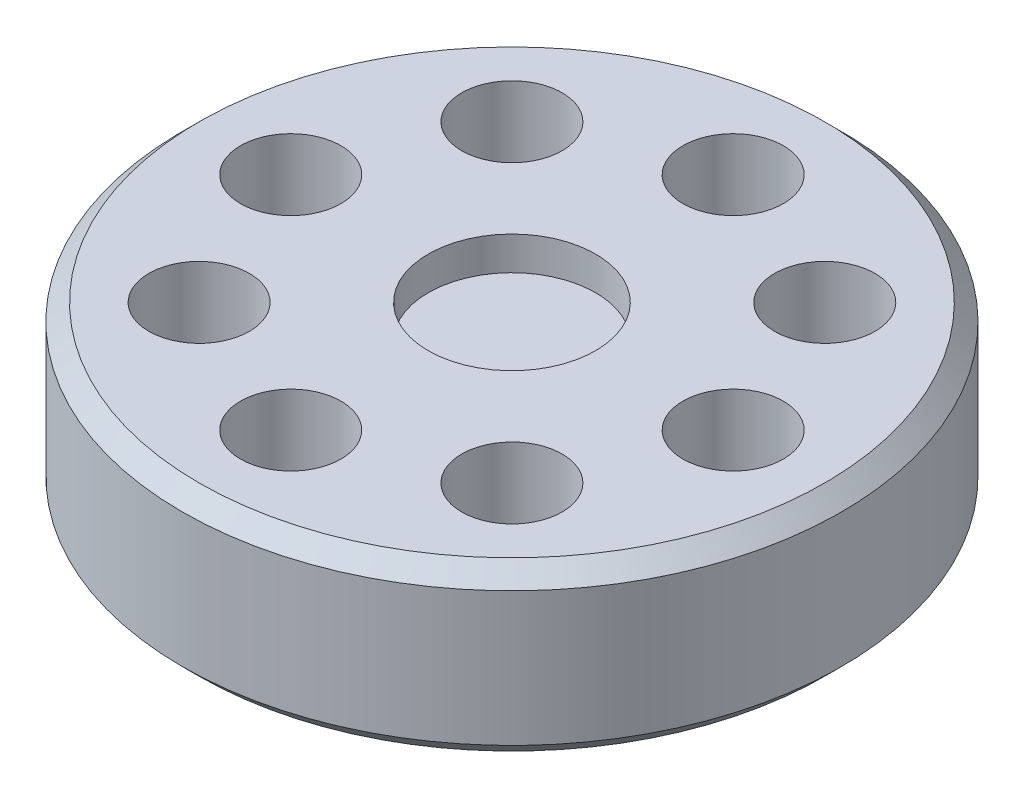
ISO-10303-21;
HEADER;
FILE_DESCRIPTION(('STEP AP214'),'2;1');
FILE_NAME('part.step','',(''),(''),'','','');
FILE_SCHEMA(('AUTOMOTIVE_DESIGN { 1 0 10303 214 1 1 1 1 }'));
ENDSEC;
DATA;
#1=APPLICATION_CONTEXT('core data for automotive mechanical design processes');
#2=APPLICATION_PROTOCOL_DEFINITION('international standard','automotive_design',2000,#1);
#3=PRODUCT_CONTEXT('',#1,'mechanical');
#4=PRODUCT('Part','Part','',(#3));
#5=PRODUCT_RELATED_PRODUCT_CATEGORY('part','',(#4));
#6=PRODUCT_DEFINITION_FORMATION('','',#4);
#7=PRODUCT_DEFINITION_CONTEXT('part definition',#1,'design');
#8=PRODUCT_DEFINITION('design','',#6,#7);
#9=PRODUCT_DEFINITION_SHAPE('','',#8);
#10=(LENGTH_UNIT() NAMED_UNIT(*) SI_UNIT(.MILLI.,.METRE.));
#11=(NAMED_UNIT(*) PLANE_ANGLE_UNIT() SI_UNIT($,.RADIAN.));
#12=(NAMED_UNIT(*) SI_UNIT($,.STERADIAN.) SOLID_ANGLE_UNIT());
#13=UNCERTAINTY_MEASURE_WITH_UNIT(LENGTH_MEASURE(1.E-05),#10,'distance_accuracy_value','');
#14=(GEOMETRIC_REPRESENTATION_CONTEXT(3) GLOBAL_UNCERTAINTY_ASSIGNED_CONTEXT((#13)) GLOBAL_UNIT_ASSIGNED_CONTEXT((#10,
#11,#12)) REPRESENTATION_CONTEXT('',''));
#15=CARTESIAN_POINT('',(0.,0.,0.));
#16=DIRECTION('',(0.,0.,1.));
#17=DIRECTION('',(1.,0.,0.));
#18=AXIS2_PLACEMENT_3D('',#15,#16,#17);
#19=CARTESIAN_POINT('',(0.,25.4,0.));
#20=DIRECTION('',(0.,-1.,0.));
#21=DIRECTION('',(0.,0.,-1.));
#22=AXIS2_PLACEMENT_3D('',#19,#20,#21);
#23=CYLINDRICAL_SURFACE('',#22,50.);
#24=CARTESIAN_POINT('',(0.,2.54000000000001,0.));
#25=DIRECTION('',(0.,1.,0.));
#26=DIRECTION('',(0.,0.,1.));
#27=AXIS2_PLACEMENT_3D('',#24,#25,#26);
#28=CIRCLE('',#27,50.);
#29=CARTESIAN_POINT('',(0.,2.54000000000001,50.));
#30=VERTEX_POINT('',#29);
#31=EDGE_CURVE('E43',#30,#30,#28,.T.);
#32=ORIENTED_EDGE('',*,*,#31,.T.);
#33=EDGE_LOOP('',(#32));
#34=FACE_BOUND('',#33,.T.);
#35=CARTESIAN_POINT('',(0.,22.86,0.));
#36=DIRECTION('',(0.,1.,0.));
#37=DIRECTION('',(0.,0.,1.));
#38=AXIS2_PLACEMENT_3D('',#35,#36,#37);
#39=CIRCLE('',#38,50.);
#40=CARTESIAN_POINT('',(0.,22.86,50.));
#41=VERTEX_POINT('',#40);
#42=EDGE_CURVE('E47',#41,#41,#39,.F.);
#43=ORIENTED_EDGE('',*,*,#42,.T.);
#44=EDGE_LOOP('',(#43));
#45=FACE_BOUND('',#44,.T.);
#46=ADVANCED_FACE('F32',(#34,#45),#23,.T.);
#47=CARTESIAN_POINT('',(0.,25.4,0.));
#48=DIRECTION('',(0.,1.,0.));
#49=DIRECTION('',(0.,0.,1.));
#50=AXIS2_PLACEMENT_3D('',#47,#48,#49);
#51=PLANE('',#50);
#52=CARTESIAN_POINT('',(-23.73,25.4,-23.73));
#53=DIRECTION('',(0.,1.,0.));
#54=DIRECTION('',(0.,0.,1.));
#55=AXIS2_PLACEMENT_3D('',#52,#53,#54);
#56=CIRCLE('',#55,7.62);
#57=CARTESIAN_POINT('',(-23.73,25.4,-16.11));
#58=VERTEX_POINT('',#57);
#59=EDGE_CURVE('E75',#58,#58,#56,.T.);
#60=ORIENTED_EDGE('',*,*,#59,.F.);
#61=EDGE_LOOP('',(#60));
#62=FACE_BOUND('',#61,.T.);
#63=CARTESIAN_POINT('',(23.73,25.4,-23.73));
#64=DIRECTION('',(0.,1.,0.));
#65=DIRECTION('',(0.,0.,1.));
#66=AXIS2_PLACEMENT_3D('',#63,#64,#65);
#67=CIRCLE('',#66,7.62);
#68=CARTESIAN_POINT('',(23.73,25.4,-16.11));
#69=VERTEX_POINT('',#68);
#70=EDGE_CURVE('E68',#69,#69,#67,.T.);
#71=ORIENTED_EDGE('',*,*,#70,.F.);
#72=EDGE_LOOP('',(#71));
#73=FACE_BOUND('',#72,.T.);
#74=CARTESIAN_POINT('',(-2.0122792321331E-13,25.4,-33.5592878351133));
#75=DIRECTION('',(0.,1.,0.));
#76=DIRECTION('',(0.,0.,1.));
#77=AXIS2_PLACEMENT_3D('',#74,#75,#76);
#78=CIRCLE('',#77,7.62);
#79=CARTESIAN_POINT('',(-2.0122792321331E-13,25.4,-25.9392878351133));
#80=VERTEX_POINT('',#79);
#81=EDGE_CURVE('E69',#80,#80,#78,.T.);
#82=ORIENTED_EDGE('',*,*,#81,.F.);
#83=EDGE_LOOP('',(#82));
#84=FACE_BOUND('',#83,.T.);
#85=CARTESIAN_POINT('',(-33.5592878351138,25.4,2.08166817117217E-13));
#86=DIRECTION('',(0.,1.,0.));
#87=DIRECTION('',(0.,0.,1.));
#88=AXIS2_PLACEMENT_3D('',#85,#86,#87);
#89=CIRCLE('',#88,7.62);
#90=CARTESIAN_POINT('',(-33.5592878351138,25.4,7.62000000000021));
#91=VERTEX_POINT('',#90);
#92=EDGE_CURVE('E86',#91,#91,#89,.T.);
#93=ORIENTED_EDGE('',*,*,#92,.F.);
#94=EDGE_LOOP('',(#93));
#95=FACE_BOUND('',#94,.T.);
#96=CARTESIAN_POINT('',(-23.73,25.4,23.73));
#97=DIRECTION('',(0.,1.,0.));
#98=DIRECTION('',(0.,0.,1.));
#99=AXIS2_PLACEMENT_3D('',#96,#97,#98);
#100=CIRCLE('',#99,7.62);
#101=CARTESIAN_POINT('',(-23.73,25.4,31.35));
#102=VERTEX_POINT('',#101);
#103=EDGE_CURVE('E92',#102,#102,#100,.T.);
#104=ORIENTED_EDGE('',*,*,#103,.F.);
#105=EDGE_LOOP('',(#104));
#106=FACE_BOUND('',#105,.T.);
#107=CARTESIAN_POINT('',(2.0122792321331E-13,25.4,33.5592878351133));
#108=DIRECTION('',(0.,1.,0.));
#109=DIRECTION('',(0.,0.,1.));
#110=AXIS2_PLACEMENT_3D('',#107,#108,#109);
#111=CIRCLE('',#110,7.62);
#112=CARTESIAN_POINT('',(2.0122792321331E-13,25.4,41.1792878351133));
#113=VERTEX_POINT('',#112);
#114=EDGE_CURVE('E98',#113,#113,#111,.T.);
#115=ORIENTED_EDGE('',*,*,#114,.F.);
#116=EDGE_LOOP('',(#115));
#117=FACE_BOUND('',#116,.T.);
#118=CARTESIAN_POINT('',(23.73,25.4,23.73));
#119=DIRECTION('',(0.,1.,0.));
#120=DIRECTION('',(0.,0.,1.));
#121=AXIS2_PLACEMENT_3D('',#118,#119,#120);
#122=CIRCLE('',#121,7.62);
#123=CARTESIAN_POINT('',(23.73,25.4,31.35));
#124=VERTEX_POINT('',#123);
#125=EDGE_CURVE('E62',#124,#124,#122,.T.);
#126=ORIENTED_EDGE('',*,*,#125,.F.);
#127=EDGE_LOOP('',(#126));
#128=FACE_BOUND('',#127,.T.);
#129=CARTESIAN_POINT('',(33.5592878351138,25.4,-2.0122792321331E-13));
#130=DIRECTION('',(0.,1.,0.));
#131=DIRECTION('',(0.,0.,1.));
#132=AXIS2_PLACEMENT_3D('',#129,#130,#131);
#133=CIRCLE('',#132,7.62);
#134=CARTESIAN_POINT('',(33.5592878351138,25.4,7.6199999999998));
#135=VERTEX_POINT('',#134);
#136=EDGE_CURVE('E59',#135,#135,#133,.T.);
#137=ORIENTED_EDGE('',*,*,#136,.F.);
#138=EDGE_LOOP('',(#137));
#139=FACE_BOUND('',#138,.T.);
#140=CARTESIAN_POINT('',(0.,25.4,0.));
#141=DIRECTION('',(0.,1.,0.));
#142=DIRECTION('',(0.,0.,1.));
#143=AXIS2_PLACEMENT_3D('',#140,#141,#142);
#144=CIRCLE('',#143,47.46);
#145=CARTESIAN_POINT('',(0.,25.4,47.46));
#146=VERTEX_POINT('',#145);
#147=EDGE_CURVE('E10',#146,#146,#144,.T.);
#148=ORIENTED_EDGE('',*,*,#147,.T.);
#149=EDGE_LOOP('',(#148));
#150=FACE_BOUND('',#149,.T.);
#151=CARTESIAN_POINT('',(0.,25.4,0.));
#152=DIRECTION('',(0.,1.,0.));
#153=DIRECTION('',(0.,0.,1.));
#154=AXIS2_PLACEMENT_3D('',#151,#152,#153);
#155=CIRCLE('',#154,12.7);
#156=CARTESIAN_POINT('',(0.,25.4,12.7));
#157=VERTEX_POINT('',#156);
#158=EDGE_CURVE('E53',#157,#157,#155,.T.);
#159=ORIENTED_EDGE('',*,*,#158,.F.);
#160=EDGE_LOOP('',(#159));
#161=FACE_BOUND('',#160,.T.);
#162=ADVANCED_FACE('F109',(#62,#73,#84,#95,#106,#117,#128,#139,#150,#161),#51,.T.);
#163=CARTESIAN_POINT('',(0.,0.,0.));
#164=DIRECTION('',(0.,1.,0.));
#165=DIRECTION('',(0.,0.,1.));
#166=AXIS2_PLACEMENT_3D('',#163,#164,#165);
#167=PLANE('',#166);
#168=CARTESIAN_POINT('',(-23.73,0.,-23.73));
#169=DIRECTION('',(0.,1.,0.));
#170=DIRECTION('',(0.,0.,1.));
#171=AXIS2_PLACEMENT_3D('',#168,#169,#170);
#172=CIRCLE('',#171,7.62);
#173=CARTESIAN_POINT('',(-23.73,0.,-16.11));
#174=VERTEX_POINT('',#173);
#175=EDGE_CURVE('E72',#174,#174,#172,.T.);
#176=ORIENTED_EDGE('',*,*,#175,.T.);
#177=EDGE_LOOP('',(#176));
#178=FACE_BOUND('',#177,.T.);
#179=CARTESIAN_POINT('',(23.73,0.,-23.73));
#180=DIRECTION('',(0.,1.,0.));
#181=DIRECTION('',(0.,0.,1.));
#182=AXIS2_PLACEMENT_3D('',#179,#180,#181);
#183=CIRCLE('',#182,7.62);
#184=CARTESIAN_POINT('',(23.73,0.,-16.11));
#185=VERTEX_POINT('',#184);
#186=EDGE_CURVE('E65',#185,#185,#183,.T.);
#187=ORIENTED_EDGE('',*,*,#186,.T.);
#188=EDGE_LOOP('',(#187));
#189=FACE_BOUND('',#188,.T.);
#190=CARTESIAN_POINT('',(-2.0122792321331E-13,0.,-33.5592878351133));
#191=DIRECTION('',(0.,1.,0.));
#192=DIRECTION('',(0.,0.,1.));
#193=AXIS2_PLACEMENT_3D('',#190,#191,#192);
#194=CIRCLE('',#193,7.62);
#195=CARTESIAN_POINT('',(-2.0122792321331E-13,0.,-25.9392878351133));
#196=VERTEX_POINT('',#195);
#197=EDGE_CURVE('E79',#196,#196,#194,.T.);
#198=ORIENTED_EDGE('',*,*,#197,.T.);
#199=EDGE_LOOP('',(#198));
#200=FACE_BOUND('',#199,.T.);
#201=CARTESIAN_POINT('',(-33.5592878351138,0.,2.08166817117217E-13));
#202=DIRECTION('',(0.,1.,0.));
#203=DIRECTION('',(0.,0.,1.));
#204=AXIS2_PLACEMENT_3D('',#201,#202,#203);
#205=CIRCLE('',#204,7.62);
#206=CARTESIAN_POINT('',(-33.5592878351138,0.,7.62000000000021));
#207=VERTEX_POINT('',#206);
#208=EDGE_CURVE('E78',#207,#207,#205,.T.);
#209=ORIENTED_EDGE('',*,*,#208,.T.);
#210=EDGE_LOOP('',(#209));
#211=FACE_BOUND('',#210,.T.);
#212=CARTESIAN_POINT('',(-23.73,0.,23.73));
#213=DIRECTION('',(0.,1.,0.));
#214=DIRECTION('',(0.,0.,1.));
#215=AXIS2_PLACEMENT_3D('',#212,#213,#214);
#216=CIRCLE('',#215,7.62);
#217=CARTESIAN_POINT('',(-23.73,0.,31.35));
#218=VERTEX_POINT('',#217);
#219=EDGE_CURVE('E89',#218,#218,#216,.T.);
#220=ORIENTED_EDGE('',*,*,#219,.T.);
#221=EDGE_LOOP('',(#220));
#222=FACE_BOUND('',#221,.T.);
#223=CARTESIAN_POINT('',(2.0122792321331E-13,0.,33.5592878351133));
#224=DIRECTION('',(0.,1.,0.));
#225=DIRECTION('',(0.,0.,1.));
#226=AXIS2_PLACEMENT_3D('',#223,#224,#225);
#227=CIRCLE('',#226,7.62);
#228=CARTESIAN_POINT('',(2.0122792321331E-13,0.,41.1792878351133));
#229=VERTEX_POINT('',#228);
#230=EDGE_CURVE('E95',#229,#229,#227,.T.);
#231=ORIENTED_EDGE('',*,*,#230,.T.);
#232=EDGE_LOOP('',(#231));
#233=FACE_BOUND('',#232,.T.);
#234=CARTESIAN_POINT('',(23.73,0.,23.73));
#235=DIRECTION('',(0.,1.,0.));
#236=DIRECTION('',(0.,0.,1.));
#237=AXIS2_PLACEMENT_3D('',#234,#235,#236);
#238=CIRCLE('',#237,7.62);
#239=CARTESIAN_POINT('',(23.73,0.,31.35));
#240=VERTEX_POINT('',#239);
#241=EDGE_CURVE('E101',#240,#240,#238,.T.);
#242=ORIENTED_EDGE('',*,*,#241,.T.);
#243=EDGE_LOOP('',(#242));
#244=FACE_BOUND('',#243,.T.);
#245=CARTESIAN_POINT('',(33.5592878351138,0.,-2.0122792321331E-13));
#246=DIRECTION('',(0.,1.,0.));
#247=DIRECTION('',(0.,0.,1.));
#248=AXIS2_PLACEMENT_3D('',#245,#246,#247);
#249=CIRCLE('',#248,7.62);
#250=CARTESIAN_POINT('',(33.5592878351138,0.,7.6199999999998));
#251=VERTEX_POINT('',#250);
#252=EDGE_CURVE('E56',#251,#251,#249,.T.);
#253=ORIENTED_EDGE('',*,*,#252,.T.);
#254=EDGE_LOOP('',(#253));
#255=FACE_BOUND('',#254,.T.);
#256=CARTESIAN_POINT('',(0.,0.,0.));
#257=DIRECTION('',(0.,1.,0.));
#258=DIRECTION('',(0.,0.,1.));
#259=AXIS2_PLACEMENT_3D('',#256,#257,#258);
#260=CIRCLE('',#259,47.46);
#261=CARTESIAN_POINT('',(0.,0.,47.46));
#262=VERTEX_POINT('',#261);
#263=EDGE_CURVE('E39',#262,#262,#260,.F.);
#264=ORIENTED_EDGE('',*,*,#263,.T.);
#265=EDGE_LOOP('',(#264));
#266=FACE_BOUND('',#265,.T.);
#267=ADVANCED_FACE('F112',(#178,#189,#200,#211,#222,#233,#244,#255,#266),#167,.F.);
#268=CARTESIAN_POINT('',(0.,20.32,0.));
#269=DIRECTION('',(0.,1.,0.));
#270=DIRECTION('',(0.,0.,1.));
#271=AXIS2_PLACEMENT_3D('',#268,#269,#270);
#272=CYLINDRICAL_SURFACE('',#271,12.7);
#273=CARTESIAN_POINT('',(0.,20.32,0.));
#274=DIRECTION('',(0.,1.,0.));
#275=DIRECTION('',(0.,0.,1.));
#276=AXIS2_PLACEMENT_3D('',#273,#274,#275);
#277=CIRCLE('',#276,12.7);
#278=CARTESIAN_POINT('',(0.,20.32,12.7));
#279=VERTEX_POINT('',#278);
#280=EDGE_CURVE('E52',#279,#279,#277,.T.);
#281=ORIENTED_EDGE('',*,*,#280,.F.);
#282=EDGE_LOOP('',(#281));
#283=FACE_BOUND('',#282,.T.);
#284=ORIENTED_EDGE('',*,*,#158,.T.);
#285=EDGE_LOOP('',(#284));
#286=FACE_BOUND('',#285,.T.);
#287=ADVANCED_FACE('F119',(#283,#286),#272,.F.);
#288=CARTESIAN_POINT('',(0.,20.32,0.));
#289=DIRECTION('',(0.,1.,0.));
#290=DIRECTION('',(0.,0.,1.));
#291=AXIS2_PLACEMENT_3D('',#288,#289,#290);
#292=PLANE('',#291);
#293=ORIENTED_EDGE('',*,*,#280,.T.);
#294=EDGE_LOOP('',(#293));
#295=FACE_BOUND('',#294,.T.);
#296=ADVANCED_FACE('F121',(#295),#292,.T.);
#297=CARTESIAN_POINT('',(0.,2.54000000000001,0.));
#298=DIRECTION('',(0.,1.,0.));
#299=DIRECTION('',(0.,0.,1.));
#300=AXIS2_PLACEMENT_3D('',#297,#298,#299);
#301=CONICAL_SURFACE('',#300,50.,0.785398163397451);
#302=ORIENTED_EDGE('',*,*,#263,.F.);
#303=EDGE_LOOP('',(#302));
#304=FACE_BOUND('',#303,.T.);
#305=ORIENTED_EDGE('',*,*,#31,.F.);
#306=EDGE_LOOP('',(#305));
#307=FACE_BOUND('',#306,.T.);
#308=ADVANCED_FACE('F128',(#304,#307),#301,.T.);
#309=CARTESIAN_POINT('',(0.,25.4,0.));
#310=DIRECTION('',(0.,-1.,0.));
#311=DIRECTION('',(0.,0.,-1.));
#312=AXIS2_PLACEMENT_3D('',#309,#310,#311);
#313=CONICAL_SURFACE('',#312,47.46,0.785398163397446);
#314=ORIENTED_EDGE('',*,*,#42,.F.);
#315=EDGE_LOOP('',(#314));
#316=FACE_BOUND('',#315,.T.);
#317=ORIENTED_EDGE('',*,*,#147,.F.);
#318=EDGE_LOOP('',(#317));
#319=FACE_BOUND('',#318,.T.);
#320=ADVANCED_FACE('F34',(#316,#319),#313,.T.);
#321=CARTESIAN_POINT('',(33.5592878351138,0.,-2.0122792321331E-13));
#322=DIRECTION('',(0.,1.,0.));
#323=DIRECTION('',(0.,0.,1.));
#324=AXIS2_PLACEMENT_3D('',#321,#322,#323);
#325=CYLINDRICAL_SURFACE('',#324,7.62);
#326=ORIENTED_EDGE('',*,*,#252,.F.);
#327=EDGE_LOOP('',(#326));
#328=FACE_BOUND('',#327,.T.);
#329=ORIENTED_EDGE('',*,*,#136,.T.);
#330=EDGE_LOOP('',(#329));
#331=FACE_BOUND('',#330,.T.);
#332=ADVANCED_FACE('F145',(#328,#331),#325,.F.);
#333=CARTESIAN_POINT('',(23.73,0.,23.73));
#334=DIRECTION('',(0.,1.,0.));
#335=DIRECTION('',(0.,0.,1.));
#336=AXIS2_PLACEMENT_3D('',#333,#334,#335);
#337=CYLINDRICAL_SURFACE('',#336,7.62);
#338=ORIENTED_EDGE('',*,*,#241,.F.);
#339=EDGE_LOOP('',(#338));
#340=FACE_BOUND('',#339,.T.);
#341=ORIENTED_EDGE('',*,*,#125,.T.);
#342=EDGE_LOOP('',(#341));
#343=FACE_BOUND('',#342,.T.);
#344=ADVANCED_FACE('F107',(#340,#343),#337,.F.);
#345=CARTESIAN_POINT('',(2.0122792321331E-13,0.,33.5592878351133));
#346=DIRECTION('',(0.,1.,0.));
#347=DIRECTION('',(0.,0.,1.));
#348=AXIS2_PLACEMENT_3D('',#345,#346,#347);
#349=CYLINDRICAL_SURFACE('',#348,7.62);
#350=ORIENTED_EDGE('',*,*,#230,.F.);
#351=EDGE_LOOP('',(#350));
#352=FACE_BOUND('',#351,.T.);
#353=ORIENTED_EDGE('',*,*,#114,.T.);
#354=EDGE_LOOP('',(#353));
#355=FACE_BOUND('',#354,.T.);
#356=ADVANCED_FACE('F159',(#352,#355),#349,.F.);
#357=CARTESIAN_POINT('',(-23.73,0.,23.73));
#358=DIRECTION('',(0.,1.,0.));
#359=DIRECTION('',(0.,0.,1.));
#360=AXIS2_PLACEMENT_3D('',#357,#358,#359);
#361=CYLINDRICAL_SURFACE('',#360,7.62);
#362=ORIENTED_EDGE('',*,*,#219,.F.);
#363=EDGE_LOOP('',(#362));
#364=FACE_BOUND('',#363,.T.);
#365=ORIENTED_EDGE('',*,*,#103,.T.);
#366=EDGE_LOOP('',(#365));
#367=FACE_BOUND('',#366,.T.);
#368=ADVANCED_FACE('F180',(#364,#367),#361,.F.);
#369=CARTESIAN_POINT('',(-33.5592878351138,0.,2.08166817117217E-13));
#370=DIRECTION('',(0.,1.,0.));
#371=DIRECTION('',(0.,0.,1.));
#372=AXIS2_PLACEMENT_3D('',#369,#370,#371);
#373=CYLINDRICAL_SURFACE('',#372,7.62);
#374=ORIENTED_EDGE('',*,*,#208,.F.);
#375=EDGE_LOOP('',(#374));
#376=FACE_BOUND('',#375,.T.);
#377=ORIENTED_EDGE('',*,*,#92,.T.);
#378=EDGE_LOOP('',(#377));
#379=FACE_BOUND('',#378,.T.);
#380=ADVANCED_FACE('F176',(#376,#379),#373,.F.);
#381=CARTESIAN_POINT('',(-2.0122792321331E-13,0.,-33.5592878351133));
#382=DIRECTION('',(0.,1.,0.));
#383=DIRECTION('',(0.,0.,1.));
#384=AXIS2_PLACEMENT_3D('',#381,#382,#383);
#385=CYLINDRICAL_SURFACE('',#384,7.62);
#386=ORIENTED_EDGE('',*,*,#197,.F.);
#387=EDGE_LOOP('',(#386));
#388=FACE_BOUND('',#387,.T.);
#389=ORIENTED_EDGE('',*,*,#81,.T.);
#390=EDGE_LOOP('',(#389));
#391=FACE_BOUND('',#390,.T.);
#392=ADVANCED_FACE('F169',(#388,#391),#385,.F.);
#393=CARTESIAN_POINT('',(23.73,0.,-23.73));
#394=DIRECTION('',(0.,1.,0.));
#395=DIRECTION('',(0.,0.,1.));
#396=AXIS2_PLACEMENT_3D('',#393,#394,#395);
#397=CYLINDRICAL_SURFACE('',#396,7.62);
#398=ORIENTED_EDGE('',*,*,#186,.F.);
#399=EDGE_LOOP('',(#398));
#400=FACE_BOUND('',#399,.T.);
#401=ORIENTED_EDGE('',*,*,#70,.T.);
#402=EDGE_LOOP('',(#401));
#403=FACE_BOUND('',#402,.T.);
#404=ADVANCED_FACE('F165',(#400,#403),#397,.F.);
#405=CARTESIAN_POINT('',(-23.73,0.,-23.73));
#406=DIRECTION('',(0.,1.,0.));
#407=DIRECTION('',(0.,0.,1.));
#408=AXIS2_PLACEMENT_3D('',#405,#406,#407);
#409=CYLINDRICAL_SURFACE('',#408,7.62);
#410=ORIENTED_EDGE('',*,*,#175,.F.);
#411=EDGE_LOOP('',(#410));
#412=FACE_BOUND('',#411,.T.);
#413=ORIENTED_EDGE('',*,*,#59,.T.);
#414=EDGE_LOOP('',(#413));
#415=FACE_BOUND('',#414,.T.);
#416=ADVANCED_FACE('F168',(#412,#415),#409,.F.);
#417=CLOSED_SHELL('',(#46,#162,#267,#287,#296,#308,#320,#332,#344,#356,#368,#380,#392,#404,#416));
#418=MANIFOLD_SOLID_BREP('B2',#417);
#419=ADVANCED_BREP_SHAPE_REPRESENTATION('',(#18,#418),#14);
#420=SHAPE_DEFINITION_REPRESENTATION(#9,#419);
ENDSEC;
END-ISO-10303-21;
